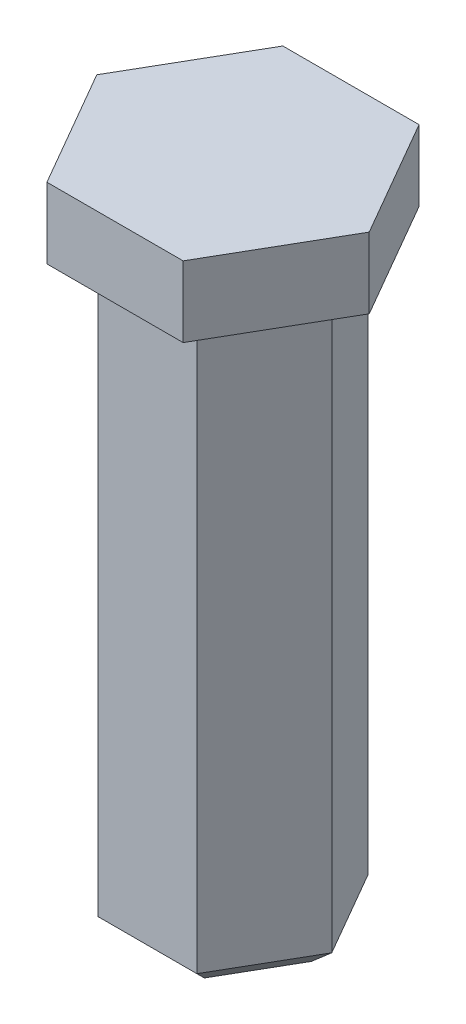
ISO-10303-21;
HEADER;
FILE_DESCRIPTION(('STEP AP214'),'2;1');
FILE_NAME('part.step','',(''),(''),'','','');
FILE_SCHEMA(('AUTOMOTIVE_DESIGN { 1 0 10303 214 1 1 1 1 }'));
ENDSEC;
DATA;
#1=APPLICATION_CONTEXT('core data for automotive mechanical design processes');
#2=APPLICATION_PROTOCOL_DEFINITION('international standard','automotive_design',2000,#1);
#3=PRODUCT_CONTEXT('',#1,'mechanical');
#4=PRODUCT('Part','Part','',(#3));
#5=PRODUCT_RELATED_PRODUCT_CATEGORY('part','',(#4));
#6=PRODUCT_DEFINITION_FORMATION('','',#4);
#7=PRODUCT_DEFINITION_CONTEXT('part definition',#1,'design');
#8=PRODUCT_DEFINITION('design','',#6,#7);
#9=PRODUCT_DEFINITION_SHAPE('','',#8);
#10=(LENGTH_UNIT() NAMED_UNIT(*) SI_UNIT(.MILLI.,.METRE.));
#11=(NAMED_UNIT(*) PLANE_ANGLE_UNIT() SI_UNIT($,.RADIAN.));
#12=(NAMED_UNIT(*) SI_UNIT($,.STERADIAN.) SOLID_ANGLE_UNIT());
#13=UNCERTAINTY_MEASURE_WITH_UNIT(LENGTH_MEASURE(1.E-05),#10,'distance_accuracy_value','');
#14=(GEOMETRIC_REPRESENTATION_CONTEXT(3) GLOBAL_UNCERTAINTY_ASSIGNED_CONTEXT((#13)) GLOBAL_UNIT_ASSIGNED_CONTEXT((#10,
#11,#12)) REPRESENTATION_CONTEXT('',''));
#15=CARTESIAN_POINT('',(0.,0.,0.));
#16=DIRECTION('',(0.,0.,1.));
#17=DIRECTION('',(1.,0.,0.));
#18=AXIS2_PLACEMENT_3D('',#15,#16,#17);
#19=CARTESIAN_POINT('',(0.837157890324958,10.,1.45));
#20=DIRECTION('',(-0.866025403784439,0.,-0.5));
#21=DIRECTION('',(-0.5,0.,0.866025403784439));
#22=AXIS2_PLACEMENT_3D('',#19,#20,#21);
#23=PLANE('',#22);
#24=DIRECTION('',(0.,-1.,0.));
#25=VECTOR('',#24,1.);
#26=CARTESIAN_POINT('',(0.837157890324958,10.,1.45));
#27=LINE('',#26,#25);
#28=CARTESIAN_POINT('',(0.837157890324958,10.,1.45));
#29=VERTEX_POINT('',#28);
#30=CARTESIAN_POINT('',(0.837157890324958,0.300000000000002,1.45));
#31=VERTEX_POINT('',#30);
#32=EDGE_CURVE('E193',#29,#31,#27,.T.);
#33=ORIENTED_EDGE('',*,*,#32,.T.);
#34=DIRECTION('',(0.5,0.,-0.866025403784439));
#35=VECTOR('',#34,1.);
#36=CARTESIAN_POINT('',(0.837157890324958,0.300000000000002,1.45));
#37=LINE('',#36,#35);
#38=CARTESIAN_POINT('',(1.67431578064991,0.300000000000002,0.));
#39=VERTEX_POINT('',#38);
#40=EDGE_CURVE('E11',#31,#39,#37,.T.);
#41=ORIENTED_EDGE('',*,*,#40,.T.);
#42=DIRECTION('',(0.,-1.,0.));
#43=VECTOR('',#42,1.);
#44=CARTESIAN_POINT('',(1.67431578064991,10.,0.));
#45=LINE('',#44,#43);
#46=CARTESIAN_POINT('',(1.67431578064991,10.,0.));
#47=VERTEX_POINT('',#46);
#48=EDGE_CURVE('E205',#47,#39,#45,.T.);
#49=ORIENTED_EDGE('',*,*,#48,.F.);
#50=DIRECTION('',(0.5,0.,-0.866025403784439));
#51=VECTOR('',#50,1.);
#52=CARTESIAN_POINT('',(0.837157890324958,10.,1.45));
#53=LINE('',#52,#51);
#54=EDGE_CURVE('E170',#29,#47,#53,.T.);
#55=ORIENTED_EDGE('',*,*,#54,.F.);
#56=EDGE_LOOP('',(#33,#41,#49,#55));
#57=FACE_BOUND('',#56,.T.);
#58=ADVANCED_FACE('F35',(#57),#23,.F.);
#59=CARTESIAN_POINT('',(1.67431578064991,10.,0.));
#60=DIRECTION('',(-0.866025403784439,0.,0.5));
#61=DIRECTION('',(0.5,0.,0.866025403784439));
#62=AXIS2_PLACEMENT_3D('',#59,#60,#61);
#63=PLANE('',#62);
#64=ORIENTED_EDGE('',*,*,#48,.T.);
#65=DIRECTION('',(-0.5,0.,-0.866025403784439));
#66=VECTOR('',#65,1.);
#67=CARTESIAN_POINT('',(1.67431578064991,0.300000000000002,0.));
#68=LINE('',#67,#66);
#69=CARTESIAN_POINT('',(0.837157890324958,0.300000000000002,-1.45));
#70=VERTEX_POINT('',#69);
#71=EDGE_CURVE('E208',#39,#70,#68,.T.);
#72=ORIENTED_EDGE('',*,*,#71,.T.);
#73=DIRECTION('',(0.,-1.,0.));
#74=VECTOR('',#73,1.);
#75=CARTESIAN_POINT('',(0.837157890324958,10.,-1.45));
#76=LINE('',#75,#74);
#77=CARTESIAN_POINT('',(0.837157890324958,10.,-1.45));
#78=VERTEX_POINT('',#77);
#79=EDGE_CURVE('E202',#78,#70,#76,.T.);
#80=ORIENTED_EDGE('',*,*,#79,.F.);
#81=DIRECTION('',(-0.5,0.,-0.866025403784439));
#82=VECTOR('',#81,1.);
#83=CARTESIAN_POINT('',(1.67431578064991,10.,0.));
#84=LINE('',#83,#82);
#85=EDGE_CURVE('E173',#47,#78,#84,.T.);
#86=ORIENTED_EDGE('',*,*,#85,.F.);
#87=EDGE_LOOP('',(#64,#72,#80,#86));
#88=FACE_BOUND('',#87,.T.);
#89=ADVANCED_FACE('F303',(#88),#63,.F.);
#90=CARTESIAN_POINT('',(0.837157890324958,10.,-1.45));
#91=DIRECTION('',(0.,0.,1.));
#92=DIRECTION('',(1.,0.,0.));
#93=AXIS2_PLACEMENT_3D('',#90,#91,#92);
#94=PLANE('',#93);
#95=ORIENTED_EDGE('',*,*,#79,.T.);
#96=DIRECTION('',(-1.,0.,0.));
#97=VECTOR('',#96,1.);
#98=CARTESIAN_POINT('',(0.837157890324958,0.300000000000002,-1.45));
#99=LINE('',#98,#97);
#100=CARTESIAN_POINT('',(-0.837157890324956,0.300000000000002,-1.45));
#101=VERTEX_POINT('',#100);
#102=EDGE_CURVE('E224',#70,#101,#99,.T.);
#103=ORIENTED_EDGE('',*,*,#102,.T.);
#104=DIRECTION('',(0.,-1.,0.));
#105=VECTOR('',#104,1.);
#106=CARTESIAN_POINT('',(-0.837157890324956,10.,-1.45));
#107=LINE('',#106,#105);
#108=CARTESIAN_POINT('',(-0.837157890324956,10.,-1.45));
#109=VERTEX_POINT('',#108);
#110=EDGE_CURVE('E199',#109,#101,#107,.T.);
#111=ORIENTED_EDGE('',*,*,#110,.F.);
#112=DIRECTION('',(-1.,0.,0.));
#113=VECTOR('',#112,1.);
#114=CARTESIAN_POINT('',(0.837157890324958,10.,-1.45));
#115=LINE('',#114,#113);
#116=EDGE_CURVE('E181',#78,#109,#115,.T.);
#117=ORIENTED_EDGE('',*,*,#116,.F.);
#118=EDGE_LOOP('',(#95,#103,#111,#117));
#119=FACE_BOUND('',#118,.T.);
#120=ADVANCED_FACE('F309',(#119),#94,.F.);
#121=CARTESIAN_POINT('',(-0.837157890324956,10.,-1.45));
#122=DIRECTION('',(0.866025403784439,0.,0.5));
#123=DIRECTION('',(0.5,0.,-0.866025403784439));
#124=AXIS2_PLACEMENT_3D('',#121,#122,#123);
#125=PLANE('',#124);
#126=ORIENTED_EDGE('',*,*,#110,.T.);
#127=DIRECTION('',(-0.5,0.,0.866025403784439));
#128=VECTOR('',#127,1.);
#129=CARTESIAN_POINT('',(-0.837157890324956,0.300000000000002,-1.45));
#130=LINE('',#129,#128);
#131=CARTESIAN_POINT('',(-1.67431578064991,0.300000000000002,0.));
#132=VERTEX_POINT('',#131);
#133=EDGE_CURVE('E226',#101,#132,#130,.T.);
#134=ORIENTED_EDGE('',*,*,#133,.T.);
#135=DIRECTION('',(0.,-1.,0.));
#136=VECTOR('',#135,1.);
#137=CARTESIAN_POINT('',(-1.67431578064991,10.,0.));
#138=LINE('',#137,#136);
#139=CARTESIAN_POINT('',(-1.67431578064991,10.,0.));
#140=VERTEX_POINT('',#139);
#141=EDGE_CURVE('E197',#140,#132,#138,.T.);
#142=ORIENTED_EDGE('',*,*,#141,.F.);
#143=DIRECTION('',(-0.5,0.,0.866025403784438));
#144=VECTOR('',#143,1.);
#145=CARTESIAN_POINT('',(-0.837157890324956,10.,-1.45));
#146=LINE('',#145,#144);
#147=EDGE_CURVE('E184',#109,#140,#146,.T.);
#148=ORIENTED_EDGE('',*,*,#147,.F.);
#149=EDGE_LOOP('',(#126,#134,#142,#148));
#150=FACE_BOUND('',#149,.T.);
#151=ADVANCED_FACE('F372',(#150),#125,.F.);
#152=CARTESIAN_POINT('',(-1.67431578064991,10.,0.));
#153=DIRECTION('',(0.866025403784439,0.,-0.5));
#154=DIRECTION('',(-0.5,0.,-0.866025403784439));
#155=AXIS2_PLACEMENT_3D('',#152,#153,#154);
#156=PLANE('',#155);
#157=ORIENTED_EDGE('',*,*,#141,.T.);
#158=DIRECTION('',(0.5,0.,0.866025403784439));
#159=VECTOR('',#158,1.);
#160=CARTESIAN_POINT('',(-1.67431578064991,0.300000000000002,0.));
#161=LINE('',#160,#159);
#162=CARTESIAN_POINT('',(-0.837157890324957,0.300000000000002,1.45));
#163=VERTEX_POINT('',#162);
#164=EDGE_CURVE('E60',#132,#163,#161,.T.);
#165=ORIENTED_EDGE('',*,*,#164,.T.);
#166=DIRECTION('',(0.,-1.,0.));
#167=VECTOR('',#166,1.);
#168=CARTESIAN_POINT('',(-0.837157890324957,10.,1.45));
#169=LINE('',#168,#167);
#170=CARTESIAN_POINT('',(-0.837157890324957,10.,1.45));
#171=VERTEX_POINT('',#170);
#172=EDGE_CURVE('E195',#171,#163,#169,.T.);
#173=ORIENTED_EDGE('',*,*,#172,.F.);
#174=DIRECTION('',(0.5,0.,0.866025403784439));
#175=VECTOR('',#174,1.);
#176=CARTESIAN_POINT('',(-1.67431578064991,10.,0.));
#177=LINE('',#176,#175);
#178=EDGE_CURVE('E187',#140,#171,#177,.T.);
#179=ORIENTED_EDGE('',*,*,#178,.F.);
#180=EDGE_LOOP('',(#157,#165,#173,#179));
#181=FACE_BOUND('',#180,.T.);
#182=ADVANCED_FACE('F370',(#181),#156,.F.);
#183=CARTESIAN_POINT('',(-0.837157890324957,10.,1.45));
#184=DIRECTION('',(0.,0.,-1.));
#185=DIRECTION('',(-1.,0.,0.));
#186=AXIS2_PLACEMENT_3D('',#183,#184,#185);
#187=PLANE('',#186);
#188=ORIENTED_EDGE('',*,*,#172,.T.);
#189=DIRECTION('',(1.,0.,0.));
#190=VECTOR('',#189,1.);
#191=CARTESIAN_POINT('',(-0.837157890324957,0.300000000000002,1.45));
#192=LINE('',#191,#190);
#193=EDGE_CURVE('E45',#163,#31,#192,.T.);
#194=ORIENTED_EDGE('',*,*,#193,.T.);
#195=ORIENTED_EDGE('',*,*,#32,.F.);
#196=DIRECTION('',(1.,0.,0.));
#197=VECTOR('',#196,1.);
#198=CARTESIAN_POINT('',(-0.837157890324957,10.,1.45));
#199=LINE('',#198,#197);
#200=EDGE_CURVE('E190',#171,#29,#199,.T.);
#201=ORIENTED_EDGE('',*,*,#200,.F.);
#202=EDGE_LOOP('',(#188,#194,#195,#201));
#203=FACE_BOUND('',#202,.T.);
#204=ADVANCED_FACE('F367',(#203),#187,.F.);
#205=CARTESIAN_POINT('',(0.,0.,0.));
#206=DIRECTION('',(0.,1.,0.));
#207=DIRECTION('',(0.,0.,1.));
#208=AXIS2_PLACEMENT_3D('',#205,#206,#207);
#209=PLANE('',#208);
#210=DIRECTION('',(1.,0.,0.));
#211=VECTOR('',#210,1.);
#212=CARTESIAN_POINT('',(0.,0.,-1.15));
#213=LINE('',#212,#211);
#214=CARTESIAN_POINT('',(-0.663952809568067,0.,-1.15));
#215=VERTEX_POINT('',#214);
#216=CARTESIAN_POINT('',(0.663952809568068,0.,-1.15));
#217=VERTEX_POINT('',#216);
#218=EDGE_CURVE('E219',#215,#217,#213,.T.);
#219=ORIENTED_EDGE('',*,*,#218,.T.);
#220=DIRECTION('',(0.5,0.,0.866025403784439));
#221=VECTOR('',#220,1.);
#222=CARTESIAN_POINT('',(0.995929214352102,0.,-0.574999999999999));
#223=LINE('',#222,#221);
#224=CARTESIAN_POINT('',(1.32790561913613,0.,0.));
#225=VERTEX_POINT('',#224);
#226=EDGE_CURVE('E221',#217,#225,#223,.T.);
#227=ORIENTED_EDGE('',*,*,#226,.T.);
#228=DIRECTION('',(-0.5,0.,0.866025403784439));
#229=VECTOR('',#228,1.);
#230=CARTESIAN_POINT('',(0.995929214352101,0.,0.574999999999998));
#231=LINE('',#230,#229);
#232=CARTESIAN_POINT('',(0.663952809568068,0.,1.15));
#233=VERTEX_POINT('',#232);
#234=EDGE_CURVE('E211',#225,#233,#231,.T.);
#235=ORIENTED_EDGE('',*,*,#234,.T.);
#236=DIRECTION('',(-1.,0.,0.));
#237=VECTOR('',#236,1.);
#238=CARTESIAN_POINT('',(0.,0.,1.15));
#239=LINE('',#238,#237);
#240=CARTESIAN_POINT('',(-0.663952809568067,0.,1.15));
#241=VERTEX_POINT('',#240);
#242=EDGE_CURVE('E213',#233,#241,#239,.T.);
#243=ORIENTED_EDGE('',*,*,#242,.T.);
#244=DIRECTION('',(-0.5,0.,-0.866025403784439));
#245=VECTOR('',#244,1.);
#246=CARTESIAN_POINT('',(-0.995929214352101,0.,0.574999999999998));
#247=LINE('',#246,#245);
#248=CARTESIAN_POINT('',(-1.32790561913613,0.,0.));
#249=VERTEX_POINT('',#248);
#250=EDGE_CURVE('E215',#241,#249,#247,.T.);
#251=ORIENTED_EDGE('',*,*,#250,.T.);
#252=DIRECTION('',(0.5,0.,-0.866025403784439));
#253=VECTOR('',#252,1.);
#254=CARTESIAN_POINT('',(-0.995929214352101,0.,-0.574999999999999));
#255=LINE('',#254,#253);
#256=EDGE_CURVE('E217',#249,#215,#255,.T.);
#257=ORIENTED_EDGE('',*,*,#256,.T.);
#258=EDGE_LOOP('',(#219,#227,#235,#243,#251,#257));
#259=FACE_BOUND('',#258,.T.);
#260=ADVANCED_FACE('F357',(#259),#209,.F.);
#261=CARTESIAN_POINT('',(0.,10.,0.));
#262=DIRECTION('',(0.,1.,0.));
#263=DIRECTION('',(0.,0.,1.));
#264=AXIS2_PLACEMENT_3D('',#261,#262,#263);
#265=PLANE('',#264);
#266=DIRECTION('',(0.499999999999999,0.,-0.866025403784439));
#267=VECTOR('',#266,1.);
#268=CARTESIAN_POINT('',(1.15470053837925,10.,2.));
#269=LINE('',#268,#267);
#270=CARTESIAN_POINT('',(1.15470053837925,10.,2.));
#271=VERTEX_POINT('',#270);
#272=CARTESIAN_POINT('',(2.3094010767585,10.,0.));
#273=VERTEX_POINT('',#272);
#274=EDGE_CURVE('E169',#271,#273,#269,.T.);
#275=ORIENTED_EDGE('',*,*,#274,.F.);
#276=DIRECTION('',(1.,0.,0.));
#277=VECTOR('',#276,1.);
#278=CARTESIAN_POINT('',(-1.15470053837925,10.,2.));
#279=LINE('',#278,#277);
#280=CARTESIAN_POINT('',(-1.15470053837925,10.,2.));
#281=VERTEX_POINT('',#280);
#282=EDGE_CURVE('E165',#281,#271,#279,.T.);
#283=ORIENTED_EDGE('',*,*,#282,.F.);
#284=DIRECTION('',(0.5,0.,0.866025403784438));
#285=VECTOR('',#284,1.);
#286=CARTESIAN_POINT('',(-2.3094010767585,10.,0.));
#287=LINE('',#286,#285);
#288=CARTESIAN_POINT('',(-2.3094010767585,10.,0.));
#289=VERTEX_POINT('',#288);
#290=EDGE_CURVE('E259',#289,#281,#287,.T.);
#291=ORIENTED_EDGE('',*,*,#290,.F.);
#292=DIRECTION('',(-0.499999999999999,0.,0.866025403784439));
#293=VECTOR('',#292,1.);
#294=CARTESIAN_POINT('',(-1.15470053837925,10.,-2.));
#295=LINE('',#294,#293);
#296=CARTESIAN_POINT('',(-1.15470053837925,10.,-2.));
#297=VERTEX_POINT('',#296);
#298=EDGE_CURVE('E257',#297,#289,#295,.T.);
#299=ORIENTED_EDGE('',*,*,#298,.F.);
#300=DIRECTION('',(-1.,0.,0.));
#301=VECTOR('',#300,1.);
#302=CARTESIAN_POINT('',(1.15470053837925,10.,-2.));
#303=LINE('',#302,#301);
#304=CARTESIAN_POINT('',(1.15470053837925,10.,-2.));
#305=VERTEX_POINT('',#304);
#306=EDGE_CURVE('E251',#305,#297,#303,.T.);
#307=ORIENTED_EDGE('',*,*,#306,.F.);
#308=DIRECTION('',(-0.5,0.,-0.866025403784439));
#309=VECTOR('',#308,1.);
#310=CARTESIAN_POINT('',(2.3094010767585,10.,0.));
#311=LINE('',#310,#309);
#312=EDGE_CURVE('E249',#273,#305,#311,.T.);
#313=ORIENTED_EDGE('',*,*,#312,.F.);
#314=EDGE_LOOP('',(#275,#283,#291,#299,#307,#313));
#315=FACE_BOUND('',#314,.T.);
#316=ORIENTED_EDGE('',*,*,#200,.T.);
#317=ORIENTED_EDGE('',*,*,#54,.T.);
#318=ORIENTED_EDGE('',*,*,#85,.T.);
#319=ORIENTED_EDGE('',*,*,#116,.T.);
#320=ORIENTED_EDGE('',*,*,#147,.T.);
#321=ORIENTED_EDGE('',*,*,#178,.T.);
#322=EDGE_LOOP('',(#316,#317,#318,#319,#320,#321));
#323=FACE_BOUND('',#322,.T.);
#324=ADVANCED_FACE('F281',(#315,#323),#265,.F.);
#325=CARTESIAN_POINT('',(1.15470053837925,11.2,2.));
#326=DIRECTION('',(-0.866025403784439,0.,-0.499999999999999));
#327=DIRECTION('',(-0.499999999999999,0.,0.866025403784439));
#328=AXIS2_PLACEMENT_3D('',#325,#326,#327);
#329=PLANE('',#328);
#330=ORIENTED_EDGE('',*,*,#274,.T.);
#331=DIRECTION('',(0.,-1.,0.));
#332=VECTOR('',#331,1.);
#333=CARTESIAN_POINT('',(2.3094010767585,11.2,0.));
#334=LINE('',#333,#332);
#335=CARTESIAN_POINT('',(2.3094010767585,11.2,0.));
#336=VERTEX_POINT('',#335);
#337=EDGE_CURVE('E149',#336,#273,#334,.T.);
#338=ORIENTED_EDGE('',*,*,#337,.F.);
#339=DIRECTION('',(0.499999999999999,0.,-0.866025403784439));
#340=VECTOR('',#339,1.);
#341=CARTESIAN_POINT('',(1.15470053837925,11.2,2.));
#342=LINE('',#341,#340);
#343=CARTESIAN_POINT('',(1.15470053837925,11.2,2.));
#344=VERTEX_POINT('',#343);
#345=EDGE_CURVE('E156',#344,#336,#342,.T.);
#346=ORIENTED_EDGE('',*,*,#345,.F.);
#347=DIRECTION('',(0.,-1.,0.));
#348=VECTOR('',#347,1.);
#349=CARTESIAN_POINT('',(1.15470053837925,11.2,2.));
#350=LINE('',#349,#348);
#351=EDGE_CURVE('E262',#344,#271,#350,.T.);
#352=ORIENTED_EDGE('',*,*,#351,.T.);
#353=EDGE_LOOP('',(#330,#338,#346,#352));
#354=FACE_BOUND('',#353,.T.);
#355=ADVANCED_FACE('F167',(#354),#329,.F.);
#356=CARTESIAN_POINT('',(2.3094010767585,11.2,0.));
#357=DIRECTION('',(-0.866025403784439,0.,0.5));
#358=DIRECTION('',(0.5,0.,0.866025403784439));
#359=AXIS2_PLACEMENT_3D('',#356,#357,#358);
#360=PLANE('',#359);
#361=ORIENTED_EDGE('',*,*,#312,.T.);
#362=DIRECTION('',(0.,-1.,0.));
#363=VECTOR('',#362,1.);
#364=CARTESIAN_POINT('',(1.15470053837925,11.2,-2.));
#365=LINE('',#364,#363);
#366=CARTESIAN_POINT('',(1.15470053837925,11.2,-2.));
#367=VERTEX_POINT('',#366);
#368=EDGE_CURVE('E152',#367,#305,#365,.T.);
#369=ORIENTED_EDGE('',*,*,#368,.F.);
#370=DIRECTION('',(-0.5,0.,-0.866025403784439));
#371=VECTOR('',#370,1.);
#372=CARTESIAN_POINT('',(2.3094010767585,11.2,0.));
#373=LINE('',#372,#371);
#374=EDGE_CURVE('E145',#336,#367,#373,.T.);
#375=ORIENTED_EDGE('',*,*,#374,.F.);
#376=ORIENTED_EDGE('',*,*,#337,.T.);
#377=EDGE_LOOP('',(#361,#369,#375,#376));
#378=FACE_BOUND('',#377,.T.);
#379=ADVANCED_FACE('F147',(#378),#360,.F.);
#380=CARTESIAN_POINT('',(1.15470053837925,11.2,-2.));
#381=DIRECTION('',(0.,0.,1.));
#382=DIRECTION('',(1.,0.,0.));
#383=AXIS2_PLACEMENT_3D('',#380,#381,#382);
#384=PLANE('',#383);
#385=ORIENTED_EDGE('',*,*,#306,.T.);
#386=DIRECTION('',(0.,-1.,0.));
#387=VECTOR('',#386,1.);
#388=CARTESIAN_POINT('',(-1.15470053837925,11.2,-2.));
#389=LINE('',#388,#387);
#390=CARTESIAN_POINT('',(-1.15470053837925,11.2,-2.));
#391=VERTEX_POINT('',#390);
#392=EDGE_CURVE('E175',#391,#297,#389,.T.);
#393=ORIENTED_EDGE('',*,*,#392,.F.);
#394=DIRECTION('',(-1.,0.,0.));
#395=VECTOR('',#394,1.);
#396=CARTESIAN_POINT('',(1.15470053837925,11.2,-2.));
#397=LINE('',#396,#395);
#398=EDGE_CURVE('E155',#367,#391,#397,.T.);
#399=ORIENTED_EDGE('',*,*,#398,.F.);
#400=ORIENTED_EDGE('',*,*,#368,.T.);
#401=EDGE_LOOP('',(#385,#393,#399,#400));
#402=FACE_BOUND('',#401,.T.);
#403=ADVANCED_FACE('F293',(#402),#384,.F.);
#404=CARTESIAN_POINT('',(-1.15470053837925,11.2,-2.));
#405=DIRECTION('',(0.866025403784439,0.,0.499999999999999));
#406=DIRECTION('',(0.5,0.,-0.866025403784439));
#407=AXIS2_PLACEMENT_3D('',#404,#405,#406);
#408=PLANE('',#407);
#409=ORIENTED_EDGE('',*,*,#298,.T.);
#410=DIRECTION('',(0.,-1.,0.));
#411=VECTOR('',#410,1.);
#412=CARTESIAN_POINT('',(-2.3094010767585,11.2,0.));
#413=LINE('',#412,#411);
#414=CARTESIAN_POINT('',(-2.3094010767585,11.2,0.));
#415=VERTEX_POINT('',#414);
#416=EDGE_CURVE('E267',#415,#289,#413,.T.);
#417=ORIENTED_EDGE('',*,*,#416,.F.);
#418=DIRECTION('',(-0.499999999999999,0.,0.866025403784439));
#419=VECTOR('',#418,1.);
#420=CARTESIAN_POINT('',(-1.15470053837925,11.2,-2.));
#421=LINE('',#420,#419);
#422=EDGE_CURVE('E276',#391,#415,#421,.T.);
#423=ORIENTED_EDGE('',*,*,#422,.F.);
#424=ORIENTED_EDGE('',*,*,#392,.T.);
#425=EDGE_LOOP('',(#409,#417,#423,#424));
#426=FACE_BOUND('',#425,.T.);
#427=ADVANCED_FACE('F274',(#426),#408,.F.);
#428=CARTESIAN_POINT('',(-2.3094010767585,11.2,0.));
#429=DIRECTION('',(0.866025403784439,0.,-0.5));
#430=DIRECTION('',(-0.5,0.,-0.866025403784439));
#431=AXIS2_PLACEMENT_3D('',#428,#429,#430);
#432=PLANE('',#431);
#433=ORIENTED_EDGE('',*,*,#290,.T.);
#434=DIRECTION('',(0.,-1.,0.));
#435=VECTOR('',#434,1.);
#436=CARTESIAN_POINT('',(-1.15470053837925,11.2,2.));
#437=LINE('',#436,#435);
#438=CARTESIAN_POINT('',(-1.15470053837925,11.2,2.));
#439=VERTEX_POINT('',#438);
#440=EDGE_CURVE('E264',#439,#281,#437,.T.);
#441=ORIENTED_EDGE('',*,*,#440,.F.);
#442=DIRECTION('',(0.5,0.,0.866025403784438));
#443=VECTOR('',#442,1.);
#444=CARTESIAN_POINT('',(-2.3094010767585,11.2,0.));
#445=LINE('',#444,#443);
#446=EDGE_CURVE('E290',#415,#439,#445,.T.);
#447=ORIENTED_EDGE('',*,*,#446,.F.);
#448=ORIENTED_EDGE('',*,*,#416,.T.);
#449=EDGE_LOOP('',(#433,#441,#447,#448));
#450=FACE_BOUND('',#449,.T.);
#451=ADVANCED_FACE('F286',(#450),#432,.F.);
#452=CARTESIAN_POINT('',(-1.15470053837925,11.2,2.));
#453=DIRECTION('',(0.,0.,-1.));
#454=DIRECTION('',(-1.,0.,0.));
#455=AXIS2_PLACEMENT_3D('',#452,#453,#454);
#456=PLANE('',#455);
#457=ORIENTED_EDGE('',*,*,#282,.T.);
#458=ORIENTED_EDGE('',*,*,#351,.F.);
#459=DIRECTION('',(1.,0.,0.));
#460=VECTOR('',#459,1.);
#461=CARTESIAN_POINT('',(-1.15470053837925,11.2,2.));
#462=LINE('',#461,#460);
#463=EDGE_CURVE('E161',#439,#344,#462,.T.);
#464=ORIENTED_EDGE('',*,*,#463,.F.);
#465=ORIENTED_EDGE('',*,*,#440,.T.);
#466=EDGE_LOOP('',(#457,#458,#464,#465));
#467=FACE_BOUND('',#466,.T.);
#468=ADVANCED_FACE('F289',(#467),#456,.F.);
#469=CARTESIAN_POINT('',(0.,11.2,0.));
#470=DIRECTION('',(0.,1.,0.));
#471=DIRECTION('',(0.,0.,1.));
#472=AXIS2_PLACEMENT_3D('',#469,#470,#471);
#473=PLANE('',#472);
#474=ORIENTED_EDGE('',*,*,#345,.T.);
#475=ORIENTED_EDGE('',*,*,#374,.T.);
#476=ORIENTED_EDGE('',*,*,#398,.T.);
#477=ORIENTED_EDGE('',*,*,#422,.T.);
#478=ORIENTED_EDGE('',*,*,#446,.T.);
#479=ORIENTED_EDGE('',*,*,#463,.T.);
#480=EDGE_LOOP('',(#474,#475,#476,#477,#478,#479));
#481=FACE_BOUND('',#480,.T.);
#482=ADVANCED_FACE('F159',(#481),#473,.T.);
#483=CARTESIAN_POINT('',(-1.67431578064991,0.300000000000002,0.));
#484=DIRECTION('',(0.612372435695793,0.70710678118655,-0.353553390593273));
#485=DIRECTION('',(0.5,0.,0.866025403784439));
#486=AXIS2_PLACEMENT_3D('',#483,#484,#485);
#487=PLANE('',#486);
#488=DIRECTION('',(0.755928946018456,-0.654653670707975,0.));
#489=VECTOR('',#488,1.);
#490=CARTESIAN_POINT('',(-1.67431578064991,0.300000000000002,0.));
#491=LINE('',#490,#489);
#492=EDGE_CURVE('E239',#249,#132,#491,.F.);
#493=ORIENTED_EDGE('',*,*,#492,.F.);
#494=ORIENTED_EDGE('',*,*,#250,.F.);
#495=DIRECTION('',(0.377964473009228,-0.654653670707975,-0.654653670707979));
#496=VECTOR('',#495,1.);
#497=CARTESIAN_POINT('',(-0.837157890324957,0.300000000000002,1.45));
#498=LINE('',#497,#496);
#499=EDGE_CURVE('E40',#163,#241,#498,.T.);
#500=ORIENTED_EDGE('',*,*,#499,.F.);
#501=ORIENTED_EDGE('',*,*,#164,.F.);
#502=EDGE_LOOP('',(#493,#494,#500,#501));
#503=FACE_BOUND('',#502,.T.);
#504=ADVANCED_FACE('F38',(#503),#487,.F.);
#505=CARTESIAN_POINT('',(-0.837157890324957,0.300000000000002,1.45));
#506=DIRECTION('',(0.,0.70710678118655,-0.707106781186545));
#507=DIRECTION('',(1.,0.,0.));
#508=AXIS2_PLACEMENT_3D('',#505,#506,#507);
#509=PLANE('',#508);
#510=ORIENTED_EDGE('',*,*,#499,.T.);
#511=ORIENTED_EDGE('',*,*,#242,.F.);
#512=DIRECTION('',(-0.377964473009229,-0.654653670707974,-0.654653670707979));
#513=VECTOR('',#512,1.);
#514=CARTESIAN_POINT('',(0.837157890324958,0.300000000000002,1.45));
#515=LINE('',#514,#513);
#516=EDGE_CURVE('E237',#31,#233,#515,.T.);
#517=ORIENTED_EDGE('',*,*,#516,.F.);
#518=ORIENTED_EDGE('',*,*,#193,.F.);
#519=EDGE_LOOP('',(#510,#511,#517,#518));
#520=FACE_BOUND('',#519,.T.);
#521=ADVANCED_FACE('F341',(#520),#509,.F.);
#522=CARTESIAN_POINT('',(-0.837157890324956,0.300000000000002,-1.45));
#523=DIRECTION('',(0.612372435695793,0.70710678118655,0.353553390593273));
#524=DIRECTION('',(-0.5,0.,0.866025403784439));
#525=AXIS2_PLACEMENT_3D('',#522,#523,#524);
#526=PLANE('',#525);
#527=ORIENTED_EDGE('',*,*,#492,.T.);
#528=ORIENTED_EDGE('',*,*,#133,.F.);
#529=DIRECTION('',(0.377964473009228,-0.654653670707975,0.65465367070798));
#530=VECTOR('',#529,1.);
#531=CARTESIAN_POINT('',(-0.837157890324956,0.300000000000002,-1.45));
#532=LINE('',#531,#530);
#533=EDGE_CURVE('E234',#215,#101,#532,.F.);
#534=ORIENTED_EDGE('',*,*,#533,.F.);
#535=ORIENTED_EDGE('',*,*,#256,.F.);
#536=EDGE_LOOP('',(#527,#528,#534,#535));
#537=FACE_BOUND('',#536,.T.);
#538=ADVANCED_FACE('F335',(#537),#526,.F.);
#539=CARTESIAN_POINT('',(0.837157890324958,0.300000000000002,1.45));
#540=DIRECTION('',(-0.612372435695792,0.70710678118655,-0.353553390593272));
#541=DIRECTION('',(0.5,0.,-0.866025403784439));
#542=AXIS2_PLACEMENT_3D('',#539,#540,#541);
#543=PLANE('',#542);
#544=ORIENTED_EDGE('',*,*,#516,.T.);
#545=ORIENTED_EDGE('',*,*,#234,.F.);
#546=DIRECTION('',(0.755928946018457,0.654653670707974,0.));
#547=VECTOR('',#546,1.);
#548=CARTESIAN_POINT('',(1.19593984332137,-0.114285714285712,0.));
#549=LINE('',#548,#547);
#550=EDGE_CURVE('E232',#39,#225,#549,.F.);
#551=ORIENTED_EDGE('',*,*,#550,.F.);
#552=ORIENTED_EDGE('',*,*,#40,.F.);
#553=EDGE_LOOP('',(#544,#545,#551,#552));
#554=FACE_BOUND('',#553,.T.);
#555=ADVANCED_FACE('F328',(#554),#543,.F.);
#556=CARTESIAN_POINT('',(0.837157890324958,0.300000000000002,-1.45));
#557=DIRECTION('',(0.,0.70710678118655,0.707106781186545));
#558=DIRECTION('',(-1.,0.,0.));
#559=AXIS2_PLACEMENT_3D('',#556,#557,#558);
#560=PLANE('',#559);
#561=ORIENTED_EDGE('',*,*,#533,.T.);
#562=ORIENTED_EDGE('',*,*,#102,.F.);
#563=DIRECTION('',(-0.377964473009229,-0.654653670707974,0.654653670707979));
#564=VECTOR('',#563,1.);
#565=CARTESIAN_POINT('',(0.837157890324958,0.300000000000002,-1.45));
#566=LINE('',#565,#564);
#567=EDGE_CURVE('E230',#217,#70,#566,.F.);
#568=ORIENTED_EDGE('',*,*,#567,.F.);
#569=ORIENTED_EDGE('',*,*,#218,.F.);
#570=EDGE_LOOP('',(#561,#562,#568,#569));
#571=FACE_BOUND('',#570,.T.);
#572=ADVANCED_FACE('F321',(#571),#560,.F.);
#573=CARTESIAN_POINT('',(1.67431578064991,0.300000000000002,0.));
#574=DIRECTION('',(-0.612372435695792,0.70710678118655,0.353553390593272));
#575=DIRECTION('',(-0.5,0.,-0.866025403784439));
#576=AXIS2_PLACEMENT_3D('',#573,#574,#575);
#577=PLANE('',#576);
#578=ORIENTED_EDGE('',*,*,#550,.T.);
#579=ORIENTED_EDGE('',*,*,#226,.F.);
#580=ORIENTED_EDGE('',*,*,#567,.T.);
#581=ORIENTED_EDGE('',*,*,#71,.F.);
#582=EDGE_LOOP('',(#578,#579,#580,#581));
#583=FACE_BOUND('',#582,.T.);
#584=ADVANCED_FACE('F315',(#583),#577,.F.);
#585=CLOSED_SHELL('',(#58,#89,#120,#151,#182,#204,#260,#324,#355,#379,#403,#427,#451,#468,#482,
#504,#521,#538,#555,#572,#584));
#586=MANIFOLD_SOLID_BREP('B2',#585);
#587=ADVANCED_BREP_SHAPE_REPRESENTATION('',(#18,#586),#14);
#588=SHAPE_DEFINITION_REPRESENTATION(#9,#587);
ENDSEC;
END-ISO-10303-21;
